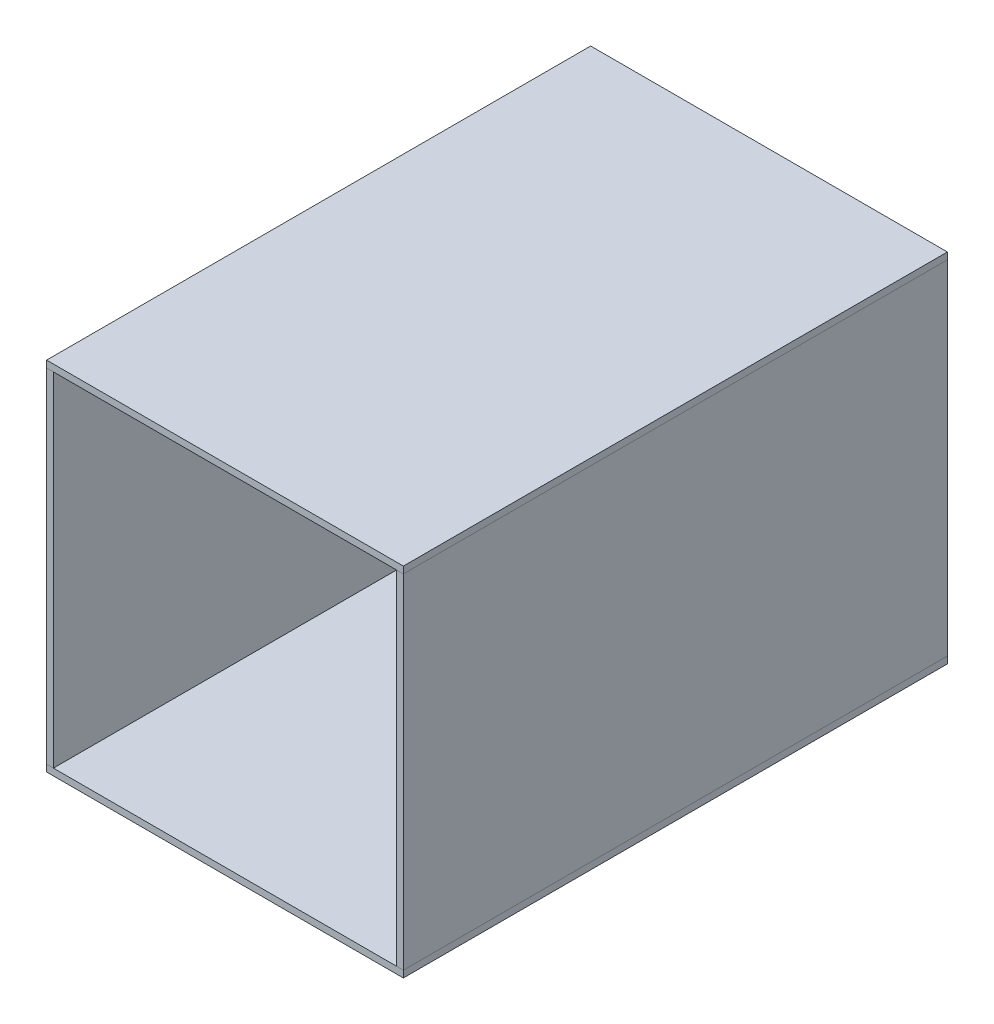
ISO-10303-21;
HEADER;
FILE_DESCRIPTION(('STEP AP214'),'2;1');
FILE_NAME('part.step','',(''),(''),'','','');
FILE_SCHEMA(('AUTOMOTIVE_DESIGN { 1 0 10303 214 1 1 1 1 }'));
ENDSEC;
DATA;
#1=APPLICATION_CONTEXT('core data for automotive mechanical design processes');
#2=APPLICATION_PROTOCOL_DEFINITION('international standard','automotive_design',2000,#1);
#3=PRODUCT_CONTEXT('',#1,'mechanical');
#4=PRODUCT('Part','Part','',(#3));
#5=PRODUCT_RELATED_PRODUCT_CATEGORY('part','',(#4));
#6=PRODUCT_DEFINITION_FORMATION('','',#4);
#7=PRODUCT_DEFINITION_CONTEXT('part definition',#1,'design');
#8=PRODUCT_DEFINITION('design','',#6,#7);
#9=PRODUCT_DEFINITION_SHAPE('','',#8);
#10=(LENGTH_UNIT() NAMED_UNIT(*) SI_UNIT(.MILLI.,.METRE.));
#11=(NAMED_UNIT(*) PLANE_ANGLE_UNIT() SI_UNIT($,.RADIAN.));
#12=(NAMED_UNIT(*) SI_UNIT($,.STERADIAN.) SOLID_ANGLE_UNIT());
#13=UNCERTAINTY_MEASURE_WITH_UNIT(LENGTH_MEASURE(1.E-05),#10,'distance_accuracy_value','');
#14=(GEOMETRIC_REPRESENTATION_CONTEXT(3) GLOBAL_UNCERTAINTY_ASSIGNED_CONTEXT((#13)) GLOBAL_UNIT_ASSIGNED_CONTEXT((#10,
#11,#12)) REPRESENTATION_CONTEXT('',''));
#15=CARTESIAN_POINT('',(0.,0.,0.));
#16=DIRECTION('',(0.,0.,1.));
#17=DIRECTION('',(1.,0.,0.));
#18=AXIS2_PLACEMENT_3D('',#15,#16,#17);
#19=CARTESIAN_POINT('',(0.,9.525,1262.59071739535));
#20=DIRECTION('',(0.,1.,0.));
#21=DIRECTION('',(0.,0.,1.));
#22=AXIS2_PLACEMENT_3D('',#19,#20,#21);
#23=PLANE('',#22);
#24=DIRECTION('',(0.,0.,-1.));
#25=VECTOR('',#24,1.);
#26=CARTESIAN_POINT('',(-250.,9.525,1262.59071739535));
#27=LINE('',#26,#25);
#28=CARTESIAN_POINT('',(-250.,9.525,762.5));
#29=VERTEX_POINT('',#28);
#30=CARTESIAN_POINT('',(-250.,9.525,0.));
#31=VERTEX_POINT('',#30);
#32=EDGE_CURVE('E90',#29,#31,#27,.T.);
#33=ORIENTED_EDGE('',*,*,#32,.F.);
#34=DIRECTION('',(1.,0.,0.));
#35=VECTOR('',#34,1.);
#36=CARTESIAN_POINT('',(0.,9.525,762.5));
#37=LINE('',#36,#35);
#38=CARTESIAN_POINT('',(250.,9.525,762.5));
#39=VERTEX_POINT('',#38);
#40=EDGE_CURVE('E102',#29,#39,#37,.T.);
#41=ORIENTED_EDGE('',*,*,#40,.T.);
#42=DIRECTION('',(0.,0.,-1.));
#43=VECTOR('',#42,1.);
#44=CARTESIAN_POINT('',(250.,9.525,1262.59071739535));
#45=LINE('',#44,#43);
#46=CARTESIAN_POINT('',(250.,9.525,0.));
#47=VERTEX_POINT('',#46);
#48=EDGE_CURVE('E55',#39,#47,#45,.T.);
#49=ORIENTED_EDGE('',*,*,#48,.T.);
#50=DIRECTION('',(1.,0.,0.));
#51=VECTOR('',#50,1.);
#52=CARTESIAN_POINT('',(0.,9.525,0.));
#53=LINE('',#52,#51);
#54=EDGE_CURVE('E99',#31,#47,#53,.T.);
#55=ORIENTED_EDGE('',*,*,#54,.F.);
#56=EDGE_LOOP('',(#33,#41,#49,#55));
#57=FACE_BOUND('',#56,.T.);
#58=ADVANCED_FACE('F51',(#57),#23,.T.);
#59=CARTESIAN_POINT('',(-250.,0.,1262.59071739535));
#60=DIRECTION('',(-1.,0.,0.));
#61=DIRECTION('',(0.,0.,1.));
#62=AXIS2_PLACEMENT_3D('',#59,#60,#61);
#63=PLANE('',#62);
#64=DIRECTION('',(0.,0.,-1.));
#65=VECTOR('',#64,1.);
#66=CARTESIAN_POINT('',(-250.,0.,1262.59071739535));
#67=LINE('',#66,#65);
#68=CARTESIAN_POINT('',(-250.,0.,762.5));
#69=VERTEX_POINT('',#68);
#70=CARTESIAN_POINT('',(-250.,0.,0.));
#71=VERTEX_POINT('',#70);
#72=EDGE_CURVE('E120',#69,#71,#67,.T.);
#73=ORIENTED_EDGE('',*,*,#72,.F.);
#74=DIRECTION('',(0.,1.,0.));
#75=VECTOR('',#74,1.);
#76=CARTESIAN_POINT('',(-250.,0.,762.5));
#77=LINE('',#76,#75);
#78=EDGE_CURVE('E96',#69,#29,#77,.T.);
#79=ORIENTED_EDGE('',*,*,#78,.T.);
#80=ORIENTED_EDGE('',*,*,#32,.T.);
#81=DIRECTION('',(0.,1.,0.));
#82=VECTOR('',#81,1.);
#83=CARTESIAN_POINT('',(-250.,0.,0.));
#84=LINE('',#83,#82);
#85=EDGE_CURVE('E110',#71,#31,#84,.T.);
#86=ORIENTED_EDGE('',*,*,#85,.F.);
#87=EDGE_LOOP('',(#73,#79,#80,#86));
#88=FACE_BOUND('',#87,.T.);
#89=ADVANCED_FACE('F124',(#88),#63,.T.);
#90=CARTESIAN_POINT('',(0.,0.,1262.59071739535));
#91=DIRECTION('',(0.,1.,0.));
#92=DIRECTION('',(0.,0.,1.));
#93=AXIS2_PLACEMENT_3D('',#90,#91,#92);
#94=PLANE('',#93);
#95=DIRECTION('',(1.,0.,0.));
#96=VECTOR('',#95,1.);
#97=CARTESIAN_POINT('',(0.,0.,762.5));
#98=LINE('',#97,#96);
#99=CARTESIAN_POINT('',(250.,0.,762.5));
#100=VERTEX_POINT('',#99);
#101=EDGE_CURVE('E60',#69,#100,#98,.T.);
#102=ORIENTED_EDGE('',*,*,#101,.F.);
#103=ORIENTED_EDGE('',*,*,#72,.T.);
#104=DIRECTION('',(1.,0.,0.));
#105=VECTOR('',#104,1.);
#106=CARTESIAN_POINT('',(0.,0.,0.));
#107=LINE('',#106,#105);
#108=CARTESIAN_POINT('',(250.,0.,0.));
#109=VERTEX_POINT('',#108);
#110=EDGE_CURVE('E121',#71,#109,#107,.T.);
#111=ORIENTED_EDGE('',*,*,#110,.T.);
#112=DIRECTION('',(0.,0.,-1.));
#113=VECTOR('',#112,1.);
#114=CARTESIAN_POINT('',(250.,0.,1262.59071739535));
#115=LINE('',#114,#113);
#116=EDGE_CURVE('E73',#100,#109,#115,.T.);
#117=ORIENTED_EDGE('',*,*,#116,.F.);
#118=EDGE_LOOP('',(#102,#103,#111,#117));
#119=FACE_BOUND('',#118,.T.);
#120=ADVANCED_FACE('F123',(#119),#94,.F.);
#121=CARTESIAN_POINT('',(250.,0.,1262.59071739535));
#122=DIRECTION('',(-1.,0.,0.));
#123=DIRECTION('',(0.,0.,1.));
#124=AXIS2_PLACEMENT_3D('',#121,#122,#123);
#125=PLANE('',#124);
#126=DIRECTION('',(0.,1.,0.));
#127=VECTOR('',#126,1.);
#128=CARTESIAN_POINT('',(250.,0.,762.5));
#129=LINE('',#128,#127);
#130=EDGE_CURVE('E12',#100,#39,#129,.T.);
#131=ORIENTED_EDGE('',*,*,#130,.F.);
#132=ORIENTED_EDGE('',*,*,#116,.T.);
#133=DIRECTION('',(0.,1.,0.));
#134=VECTOR('',#133,1.);
#135=CARTESIAN_POINT('',(250.,0.,0.));
#136=LINE('',#135,#134);
#137=EDGE_CURVE('E104',#109,#47,#136,.T.);
#138=ORIENTED_EDGE('',*,*,#137,.T.);
#139=ORIENTED_EDGE('',*,*,#48,.F.);
#140=EDGE_LOOP('',(#131,#132,#138,#139));
#141=FACE_BOUND('',#140,.T.);
#142=ADVANCED_FACE('F105',(#141),#125,.F.);
#143=CARTESIAN_POINT('',(0.,0.,0.));
#144=DIRECTION('',(0.,0.,1.));
#145=DIRECTION('',(1.,0.,0.));
#146=AXIS2_PLACEMENT_3D('',#143,#144,#145);
#147=PLANE('',#146);
#148=ORIENTED_EDGE('',*,*,#54,.T.);
#149=ORIENTED_EDGE('',*,*,#137,.F.);
#150=ORIENTED_EDGE('',*,*,#110,.F.);
#151=ORIENTED_EDGE('',*,*,#85,.T.);
#152=EDGE_LOOP('',(#148,#149,#150,#151));
#153=FACE_BOUND('',#152,.T.);
#154=ADVANCED_FACE('F109',(#153),#147,.F.);
#155=CARTESIAN_POINT('',(0.,0.,762.5));
#156=DIRECTION('',(0.,0.,1.));
#157=DIRECTION('',(1.,0.,0.));
#158=AXIS2_PLACEMENT_3D('',#155,#156,#157);
#159=PLANE('',#158);
#160=ORIENTED_EDGE('',*,*,#40,.F.);
#161=ORIENTED_EDGE('',*,*,#78,.F.);
#162=ORIENTED_EDGE('',*,*,#101,.T.);
#163=ORIENTED_EDGE('',*,*,#130,.T.);
#164=EDGE_LOOP('',(#160,#161,#162,#163));
#165=FACE_BOUND('',#164,.T.);
#166=ADVANCED_FACE('F53',(#165),#159,.T.);
#167=CLOSED_SHELL('',(#58,#89,#120,#142,#154,#166));
#168=MANIFOLD_SOLID_BREP('B2',#167);
#169=CARTESIAN_POINT('',(0.,0.,762.5));
#170=DIRECTION('',(0.,0.,1.));
#171=DIRECTION('',(1.,0.,0.));
#172=AXIS2_PLACEMENT_3D('',#169,#170,#171);
#173=PLANE('',#172);
#174=DIRECTION('',(0.,1.,0.));
#175=VECTOR('',#174,1.);
#176=CARTESIAN_POINT('',(-250.,0.,762.5));
#177=LINE('',#176,#175);
#178=CARTESIAN_POINT('',(-250.,490.475,762.5));
#179=VERTEX_POINT('',#178);
#180=CARTESIAN_POINT('',(-250.,500.,762.5));
#181=VERTEX_POINT('',#180);
#182=EDGE_CURVE('E195',#179,#181,#177,.T.);
#183=ORIENTED_EDGE('',*,*,#182,.F.);
#184=DIRECTION('',(1.,0.,0.));
#185=VECTOR('',#184,1.);
#186=CARTESIAN_POINT('',(0.,490.475,762.5));
#187=LINE('',#186,#185);
#188=CARTESIAN_POINT('',(250.,490.475,762.5));
#189=VERTEX_POINT('',#188);
#190=EDGE_CURVE('E221',#179,#189,#187,.T.);
#191=ORIENTED_EDGE('',*,*,#190,.T.);
#192=DIRECTION('',(0.,1.,0.));
#193=VECTOR('',#192,1.);
#194=CARTESIAN_POINT('',(250.,0.,762.5));
#195=LINE('',#194,#193);
#196=CARTESIAN_POINT('',(250.,500.,762.5));
#197=VERTEX_POINT('',#196);
#198=EDGE_CURVE('E225',#189,#197,#195,.T.);
#199=ORIENTED_EDGE('',*,*,#198,.T.);
#200=DIRECTION('',(1.,0.,0.));
#201=VECTOR('',#200,1.);
#202=CARTESIAN_POINT('',(0.,500.,762.5));
#203=LINE('',#202,#201);
#204=EDGE_CURVE('E228',#181,#197,#203,.T.);
#205=ORIENTED_EDGE('',*,*,#204,.F.);
#206=EDGE_LOOP('',(#183,#191,#199,#205));
#207=FACE_BOUND('',#206,.T.);
#208=ADVANCED_FACE('F187',(#207),#173,.T.);
#209=CARTESIAN_POINT('',(0.,0.,0.));
#210=DIRECTION('',(0.,0.,1.));
#211=DIRECTION('',(1.,0.,0.));
#212=AXIS2_PLACEMENT_3D('',#209,#210,#211);
#213=PLANE('',#212);
#214=DIRECTION('',(0.,1.,0.));
#215=VECTOR('',#214,1.);
#216=CARTESIAN_POINT('',(-250.,0.,0.));
#217=LINE('',#216,#215);
#218=CARTESIAN_POINT('',(-250.,490.475,0.));
#219=VERTEX_POINT('',#218);
#220=CARTESIAN_POINT('',(-250.,500.,0.));
#221=VERTEX_POINT('',#220);
#222=EDGE_CURVE('E244',#219,#221,#217,.T.);
#223=ORIENTED_EDGE('',*,*,#222,.T.);
#224=DIRECTION('',(1.,0.,0.));
#225=VECTOR('',#224,1.);
#226=CARTESIAN_POINT('',(0.,500.,0.));
#227=LINE('',#226,#225);
#228=CARTESIAN_POINT('',(250.,500.,0.));
#229=VERTEX_POINT('',#228);
#230=EDGE_CURVE('E232',#221,#229,#227,.T.);
#231=ORIENTED_EDGE('',*,*,#230,.T.);
#232=DIRECTION('',(0.,1.,0.));
#233=VECTOR('',#232,1.);
#234=CARTESIAN_POINT('',(250.,0.,0.));
#235=LINE('',#234,#233);
#236=CARTESIAN_POINT('',(250.,490.475,0.));
#237=VERTEX_POINT('',#236);
#238=EDGE_CURVE('E248',#237,#229,#235,.T.);
#239=ORIENTED_EDGE('',*,*,#238,.F.);
#240=DIRECTION('',(1.,0.,0.));
#241=VECTOR('',#240,1.);
#242=CARTESIAN_POINT('',(0.,490.475,0.));
#243=LINE('',#242,#241);
#244=EDGE_CURVE('E236',#219,#237,#243,.T.);
#245=ORIENTED_EDGE('',*,*,#244,.F.);
#246=EDGE_LOOP('',(#223,#231,#239,#245));
#247=FACE_BOUND('',#246,.T.);
#248=ADVANCED_FACE('F261',(#247),#213,.F.);
#249=CARTESIAN_POINT('',(0.,500.,1262.59071739535));
#250=DIRECTION('',(0.,1.,0.));
#251=DIRECTION('',(0.,0.,1.));
#252=AXIS2_PLACEMENT_3D('',#249,#250,#251);
#253=PLANE('',#252);
#254=DIRECTION('',(0.,0.,-1.));
#255=VECTOR('',#254,1.);
#256=CARTESIAN_POINT('',(-250.,500.,1262.59071739535));
#257=LINE('',#256,#255);
#258=EDGE_CURVE('E49',#181,#221,#257,.T.);
#259=ORIENTED_EDGE('',*,*,#258,.F.);
#260=ORIENTED_EDGE('',*,*,#204,.T.);
#261=DIRECTION('',(0.,0.,-1.));
#262=VECTOR('',#261,1.);
#263=CARTESIAN_POINT('',(250.,500.,1262.59071739535));
#264=LINE('',#263,#262);
#265=EDGE_CURVE('E231',#197,#229,#264,.T.);
#266=ORIENTED_EDGE('',*,*,#265,.T.);
#267=ORIENTED_EDGE('',*,*,#230,.F.);
#268=EDGE_LOOP('',(#259,#260,#266,#267));
#269=FACE_BOUND('',#268,.T.);
#270=ADVANCED_FACE('F239',(#269),#253,.T.);
#271=CARTESIAN_POINT('',(250.,0.,1262.59071739535));
#272=DIRECTION('',(-1.,0.,0.));
#273=DIRECTION('',(0.,0.,1.));
#274=AXIS2_PLACEMENT_3D('',#271,#272,#273);
#275=PLANE('',#274);
#276=ORIENTED_EDGE('',*,*,#198,.F.);
#277=DIRECTION('',(0.,0.,-1.));
#278=VECTOR('',#277,1.);
#279=CARTESIAN_POINT('',(250.,490.475,1262.59071739535));
#280=LINE('',#279,#278);
#281=EDGE_CURVE('E250',#189,#237,#280,.T.);
#282=ORIENTED_EDGE('',*,*,#281,.T.);
#283=ORIENTED_EDGE('',*,*,#238,.T.);
#284=ORIENTED_EDGE('',*,*,#265,.F.);
#285=EDGE_LOOP('',(#276,#282,#283,#284));
#286=FACE_BOUND('',#285,.T.);
#287=ADVANCED_FACE('F257',(#286),#275,.F.);
#288=CARTESIAN_POINT('',(0.,490.475,1262.59071739535));
#289=DIRECTION('',(0.,1.,0.));
#290=DIRECTION('',(0.,0.,1.));
#291=AXIS2_PLACEMENT_3D('',#288,#289,#290);
#292=PLANE('',#291);
#293=ORIENTED_EDGE('',*,*,#190,.F.);
#294=DIRECTION('',(0.,0.,-1.));
#295=VECTOR('',#294,1.);
#296=CARTESIAN_POINT('',(-250.,490.475,1262.59071739535));
#297=LINE('',#296,#295);
#298=EDGE_CURVE('E235',#179,#219,#297,.T.);
#299=ORIENTED_EDGE('',*,*,#298,.T.);
#300=ORIENTED_EDGE('',*,*,#244,.T.);
#301=ORIENTED_EDGE('',*,*,#281,.F.);
#302=EDGE_LOOP('',(#293,#299,#300,#301));
#303=FACE_BOUND('',#302,.T.);
#304=ADVANCED_FACE('F260',(#303),#292,.F.);
#305=CARTESIAN_POINT('',(-250.,0.,1262.59071739535));
#306=DIRECTION('',(-1.,0.,0.));
#307=DIRECTION('',(0.,0.,1.));
#308=AXIS2_PLACEMENT_3D('',#305,#306,#307);
#309=PLANE('',#308);
#310=ORIENTED_EDGE('',*,*,#298,.F.);
#311=ORIENTED_EDGE('',*,*,#182,.T.);
#312=ORIENTED_EDGE('',*,*,#258,.T.);
#313=ORIENTED_EDGE('',*,*,#222,.F.);
#314=EDGE_LOOP('',(#310,#311,#312,#313));
#315=FACE_BOUND('',#314,.T.);
#316=ADVANCED_FACE('F234',(#315),#309,.T.);
#317=CLOSED_SHELL('',(#208,#248,#270,#287,#304,#316));
#318=MANIFOLD_SOLID_BREP('B6',#317);
#319=CARTESIAN_POINT('',(240.475,0.,762.5));
#320=DIRECTION('',(-1.,0.,0.));
#321=DIRECTION('',(0.,0.,1.));
#322=AXIS2_PLACEMENT_3D('',#319,#320,#321);
#323=PLANE('',#322);
#324=DIRECTION('',(0.,1.,0.));
#325=VECTOR('',#324,1.);
#326=CARTESIAN_POINT('',(240.475,0.,0.));
#327=LINE('',#326,#325);
#328=CARTESIAN_POINT('',(240.475,9.525,0.));
#329=VERTEX_POINT('',#328);
#330=CARTESIAN_POINT('',(240.475,490.475,0.));
#331=VERTEX_POINT('',#330);
#332=EDGE_CURVE('E385',#329,#331,#327,.T.);
#333=ORIENTED_EDGE('',*,*,#332,.F.);
#334=DIRECTION('',(0.,0.,-1.));
#335=VECTOR('',#334,1.);
#336=CARTESIAN_POINT('',(240.475,9.525,762.5));
#337=LINE('',#336,#335);
#338=CARTESIAN_POINT('',(240.475,9.525,762.5));
#339=VERTEX_POINT('',#338);
#340=EDGE_CURVE('E185',#339,#329,#337,.T.);
#341=ORIENTED_EDGE('',*,*,#340,.F.);
#342=DIRECTION('',(0.,1.,0.));
#343=VECTOR('',#342,1.);
#344=CARTESIAN_POINT('',(240.475,0.,762.5));
#345=LINE('',#344,#343);
#346=CARTESIAN_POINT('',(240.475,490.475,762.5));
#347=VERTEX_POINT('',#346);
#348=EDGE_CURVE('E370',#339,#347,#345,.T.);
#349=ORIENTED_EDGE('',*,*,#348,.T.);
#350=DIRECTION('',(0.,0.,-1.));
#351=VECTOR('',#350,1.);
#352=CARTESIAN_POINT('',(240.475,490.475,762.5));
#353=LINE('',#352,#351);
#354=EDGE_CURVE('E338',#347,#331,#353,.T.);
#355=ORIENTED_EDGE('',*,*,#354,.T.);
#356=EDGE_LOOP('',(#333,#341,#349,#355));
#357=FACE_BOUND('',#356,.T.);
#358=ADVANCED_FACE('F322',(#357),#323,.T.);
#359=CARTESIAN_POINT('',(0.,9.525,762.5));
#360=DIRECTION('',(0.,1.,0.));
#361=DIRECTION('',(0.,0.,1.));
#362=AXIS2_PLACEMENT_3D('',#359,#360,#361);
#363=PLANE('',#362);
#364=DIRECTION('',(1.,0.,0.));
#365=VECTOR('',#364,1.);
#366=CARTESIAN_POINT('',(0.,9.525,0.));
#367=LINE('',#366,#365);
#368=CARTESIAN_POINT('',(250.,9.525,0.));
#369=VERTEX_POINT('',#368);
#370=EDGE_CURVE('E376',#329,#369,#367,.T.);
#371=ORIENTED_EDGE('',*,*,#370,.T.);
#372=DIRECTION('',(0.,0.,-1.));
#373=VECTOR('',#372,1.);
#374=CARTESIAN_POINT('',(250.,9.525,762.5));
#375=LINE('',#374,#373);
#376=CARTESIAN_POINT('',(250.,9.525,762.5));
#377=VERTEX_POINT('',#376);
#378=EDGE_CURVE('E330',#377,#369,#375,.T.);
#379=ORIENTED_EDGE('',*,*,#378,.F.);
#380=DIRECTION('',(1.,0.,0.));
#381=VECTOR('',#380,1.);
#382=CARTESIAN_POINT('',(0.,9.525,762.5));
#383=LINE('',#382,#381);
#384=EDGE_CURVE('E364',#339,#377,#383,.T.);
#385=ORIENTED_EDGE('',*,*,#384,.F.);
#386=ORIENTED_EDGE('',*,*,#340,.T.);
#387=EDGE_LOOP('',(#371,#379,#385,#386));
#388=FACE_BOUND('',#387,.T.);
#389=ADVANCED_FACE('F374',(#388),#363,.F.);
#390=CARTESIAN_POINT('',(250.,0.,762.5));
#391=DIRECTION('',(-1.,0.,0.));
#392=DIRECTION('',(0.,0.,1.));
#393=AXIS2_PLACEMENT_3D('',#390,#391,#392);
#394=PLANE('',#393);
#395=DIRECTION('',(0.,1.,0.));
#396=VECTOR('',#395,1.);
#397=CARTESIAN_POINT('',(250.,0.,0.));
#398=LINE('',#397,#396);
#399=CARTESIAN_POINT('',(250.,490.475,0.));
#400=VERTEX_POINT('',#399);
#401=EDGE_CURVE('E388',#369,#400,#398,.T.);
#402=ORIENTED_EDGE('',*,*,#401,.T.);
#403=DIRECTION('',(0.,0.,-1.));
#404=VECTOR('',#403,1.);
#405=CARTESIAN_POINT('',(250.,490.475,762.5));
#406=LINE('',#405,#404);
#407=CARTESIAN_POINT('',(250.,490.475,762.5));
#408=VERTEX_POINT('',#407);
#409=EDGE_CURVE('E352',#408,#400,#406,.T.);
#410=ORIENTED_EDGE('',*,*,#409,.F.);
#411=DIRECTION('',(0.,1.,0.));
#412=VECTOR('',#411,1.);
#413=CARTESIAN_POINT('',(250.,0.,762.5));
#414=LINE('',#413,#412);
#415=EDGE_CURVE('E369',#377,#408,#414,.T.);
#416=ORIENTED_EDGE('',*,*,#415,.F.);
#417=ORIENTED_EDGE('',*,*,#378,.T.);
#418=EDGE_LOOP('',(#402,#410,#416,#417));
#419=FACE_BOUND('',#418,.T.);
#420=ADVANCED_FACE('F379',(#419),#394,.F.);
#421=CARTESIAN_POINT('',(0.,490.475,762.5));
#422=DIRECTION('',(0.,1.,0.));
#423=DIRECTION('',(0.,0.,1.));
#424=AXIS2_PLACEMENT_3D('',#421,#422,#423);
#425=PLANE('',#424);
#426=DIRECTION('',(1.,0.,0.));
#427=VECTOR('',#426,1.);
#428=CARTESIAN_POINT('',(0.,490.475,0.));
#429=LINE('',#428,#427);
#430=EDGE_CURVE('E390',#331,#400,#429,.T.);
#431=ORIENTED_EDGE('',*,*,#430,.F.);
#432=ORIENTED_EDGE('',*,*,#354,.F.);
#433=DIRECTION('',(1.,0.,0.));
#434=VECTOR('',#433,1.);
#435=CARTESIAN_POINT('',(0.,490.475,762.5));
#436=LINE('',#435,#434);
#437=EDGE_CURVE('E380',#347,#408,#436,.T.);
#438=ORIENTED_EDGE('',*,*,#437,.T.);
#439=ORIENTED_EDGE('',*,*,#409,.T.);
#440=EDGE_LOOP('',(#431,#432,#438,#439));
#441=FACE_BOUND('',#440,.T.);
#442=ADVANCED_FACE('F395',(#441),#425,.T.);
#443=CARTESIAN_POINT('',(0.,0.,762.5));
#444=DIRECTION('',(0.,0.,1.));
#445=DIRECTION('',(1.,0.,0.));
#446=AXIS2_PLACEMENT_3D('',#443,#444,#445);
#447=PLANE('',#446);
#448=ORIENTED_EDGE('',*,*,#348,.F.);
#449=ORIENTED_EDGE('',*,*,#384,.T.);
#450=ORIENTED_EDGE('',*,*,#415,.T.);
#451=ORIENTED_EDGE('',*,*,#437,.F.);
#452=EDGE_LOOP('',(#448,#449,#450,#451));
#453=FACE_BOUND('',#452,.T.);
#454=ADVANCED_FACE('F366',(#453),#447,.T.);
#455=CARTESIAN_POINT('',(0.,0.,0.));
#456=DIRECTION('',(0.,0.,1.));
#457=DIRECTION('',(1.,0.,0.));
#458=AXIS2_PLACEMENT_3D('',#455,#456,#457);
#459=PLANE('',#458);
#460=ORIENTED_EDGE('',*,*,#332,.T.);
#461=ORIENTED_EDGE('',*,*,#430,.T.);
#462=ORIENTED_EDGE('',*,*,#401,.F.);
#463=ORIENTED_EDGE('',*,*,#370,.F.);
#464=EDGE_LOOP('',(#460,#461,#462,#463));
#465=FACE_BOUND('',#464,.T.);
#466=ADVANCED_FACE('F402',(#465),#459,.F.);
#467=CLOSED_SHELL('',(#358,#389,#420,#442,#454,#466));
#468=MANIFOLD_SOLID_BREP('B43',#467);
#469=CARTESIAN_POINT('',(-250.,0.,762.5));
#470=DIRECTION('',(-1.,0.,0.));
#471=DIRECTION('',(0.,0.,1.));
#472=AXIS2_PLACEMENT_3D('',#469,#470,#471);
#473=PLANE('',#472);
#474=DIRECTION('',(0.,1.,0.));
#475=VECTOR('',#474,1.);
#476=CARTESIAN_POINT('',(-250.,0.,0.));
#477=LINE('',#476,#475);
#478=CARTESIAN_POINT('',(-250.,9.525,0.));
#479=VERTEX_POINT('',#478);
#480=CARTESIAN_POINT('',(-250.,490.475,0.));
#481=VERTEX_POINT('',#480);
#482=EDGE_CURVE('E508',#479,#481,#477,.T.);
#483=ORIENTED_EDGE('',*,*,#482,.F.);
#484=DIRECTION('',(0.,0.,-1.));
#485=VECTOR('',#484,1.);
#486=CARTESIAN_POINT('',(-250.,9.525,762.5));
#487=LINE('',#486,#485);
#488=CARTESIAN_POINT('',(-250.,9.525,762.5));
#489=VERTEX_POINT('',#488);
#490=EDGE_CURVE('E320',#489,#479,#487,.T.);
#491=ORIENTED_EDGE('',*,*,#490,.F.);
#492=DIRECTION('',(0.,1.,0.));
#493=VECTOR('',#492,1.);
#494=CARTESIAN_POINT('',(-250.,0.,762.5));
#495=LINE('',#494,#493);
#496=CARTESIAN_POINT('',(-250.,490.475,762.5));
#497=VERTEX_POINT('',#496);
#498=EDGE_CURVE('E493',#489,#497,#495,.T.);
#499=ORIENTED_EDGE('',*,*,#498,.T.);
#500=DIRECTION('',(0.,0.,-1.));
#501=VECTOR('',#500,1.);
#502=CARTESIAN_POINT('',(-250.,490.475,762.5));
#503=LINE('',#502,#501);
#504=EDGE_CURVE('E461',#497,#481,#503,.T.);
#505=ORIENTED_EDGE('',*,*,#504,.T.);
#506=EDGE_LOOP('',(#483,#491,#499,#505));
#507=FACE_BOUND('',#506,.T.);
#508=ADVANCED_FACE('F445',(#507),#473,.T.);
#509=CARTESIAN_POINT('',(0.,9.525,762.5));
#510=DIRECTION('',(0.,1.,0.));
#511=DIRECTION('',(0.,0.,1.));
#512=AXIS2_PLACEMENT_3D('',#509,#510,#511);
#513=PLANE('',#512);
#514=DIRECTION('',(1.,0.,0.));
#515=VECTOR('',#514,1.);
#516=CARTESIAN_POINT('',(0.,9.525,0.));
#517=LINE('',#516,#515);
#518=CARTESIAN_POINT('',(-240.475,9.525,0.));
#519=VERTEX_POINT('',#518);
#520=EDGE_CURVE('E499',#479,#519,#517,.T.);
#521=ORIENTED_EDGE('',*,*,#520,.T.);
#522=DIRECTION('',(0.,0.,-1.));
#523=VECTOR('',#522,1.);
#524=CARTESIAN_POINT('',(-240.475,9.525,762.5));
#525=LINE('',#524,#523);
#526=CARTESIAN_POINT('',(-240.475,9.525,762.5));
#527=VERTEX_POINT('',#526);
#528=EDGE_CURVE('E453',#527,#519,#525,.T.);
#529=ORIENTED_EDGE('',*,*,#528,.F.);
#530=DIRECTION('',(1.,0.,0.));
#531=VECTOR('',#530,1.);
#532=CARTESIAN_POINT('',(0.,9.525,762.5));
#533=LINE('',#532,#531);
#534=EDGE_CURVE('E487',#489,#527,#533,.T.);
#535=ORIENTED_EDGE('',*,*,#534,.F.);
#536=ORIENTED_EDGE('',*,*,#490,.T.);
#537=EDGE_LOOP('',(#521,#529,#535,#536));
#538=FACE_BOUND('',#537,.T.);
#539=ADVANCED_FACE('F497',(#538),#513,.F.);
#540=CARTESIAN_POINT('',(-240.475,0.,762.5));
#541=DIRECTION('',(-1.,0.,0.));
#542=DIRECTION('',(0.,0.,1.));
#543=AXIS2_PLACEMENT_3D('',#540,#541,#542);
#544=PLANE('',#543);
#545=DIRECTION('',(0.,1.,0.));
#546=VECTOR('',#545,1.);
#547=CARTESIAN_POINT('',(-240.475,0.,0.));
#548=LINE('',#547,#546);
#549=CARTESIAN_POINT('',(-240.475,490.475,0.));
#550=VERTEX_POINT('',#549);
#551=EDGE_CURVE('E511',#519,#550,#548,.T.);
#552=ORIENTED_EDGE('',*,*,#551,.T.);
#553=DIRECTION('',(0.,0.,-1.));
#554=VECTOR('',#553,1.);
#555=CARTESIAN_POINT('',(-240.475,490.475,762.5));
#556=LINE('',#555,#554);
#557=CARTESIAN_POINT('',(-240.475,490.475,762.5));
#558=VERTEX_POINT('',#557);
#559=EDGE_CURVE('E475',#558,#550,#556,.T.);
#560=ORIENTED_EDGE('',*,*,#559,.F.);
#561=DIRECTION('',(0.,1.,0.));
#562=VECTOR('',#561,1.);
#563=CARTESIAN_POINT('',(-240.475,0.,762.5));
#564=LINE('',#563,#562);
#565=EDGE_CURVE('E492',#527,#558,#564,.T.);
#566=ORIENTED_EDGE('',*,*,#565,.F.);
#567=ORIENTED_EDGE('',*,*,#528,.T.);
#568=EDGE_LOOP('',(#552,#560,#566,#567));
#569=FACE_BOUND('',#568,.T.);
#570=ADVANCED_FACE('F502',(#569),#544,.F.);
#571=CARTESIAN_POINT('',(0.,490.475,762.5));
#572=DIRECTION('',(0.,1.,0.));
#573=DIRECTION('',(0.,0.,1.));
#574=AXIS2_PLACEMENT_3D('',#571,#572,#573);
#575=PLANE('',#574);
#576=DIRECTION('',(1.,0.,0.));
#577=VECTOR('',#576,1.);
#578=CARTESIAN_POINT('',(0.,490.475,0.));
#579=LINE('',#578,#577);
#580=EDGE_CURVE('E513',#481,#550,#579,.T.);
#581=ORIENTED_EDGE('',*,*,#580,.F.);
#582=ORIENTED_EDGE('',*,*,#504,.F.);
#583=DIRECTION('',(1.,0.,0.));
#584=VECTOR('',#583,1.);
#585=CARTESIAN_POINT('',(0.,490.475,762.5));
#586=LINE('',#585,#584);
#587=EDGE_CURVE('E503',#497,#558,#586,.T.);
#588=ORIENTED_EDGE('',*,*,#587,.T.);
#589=ORIENTED_EDGE('',*,*,#559,.T.);
#590=EDGE_LOOP('',(#581,#582,#588,#589));
#591=FACE_BOUND('',#590,.T.);
#592=ADVANCED_FACE('F518',(#591),#575,.T.);
#593=CARTESIAN_POINT('',(0.,0.,762.5));
#594=DIRECTION('',(0.,0.,1.));
#595=DIRECTION('',(1.,0.,0.));
#596=AXIS2_PLACEMENT_3D('',#593,#594,#595);
#597=PLANE('',#596);
#598=ORIENTED_EDGE('',*,*,#498,.F.);
#599=ORIENTED_EDGE('',*,*,#534,.T.);
#600=ORIENTED_EDGE('',*,*,#565,.T.);
#601=ORIENTED_EDGE('',*,*,#587,.F.);
#602=EDGE_LOOP('',(#598,#599,#600,#601));
#603=FACE_BOUND('',#602,.T.);
#604=ADVANCED_FACE('F489',(#603),#597,.T.);
#605=CARTESIAN_POINT('',(0.,0.,0.));
#606=DIRECTION('',(0.,0.,1.));
#607=DIRECTION('',(1.,0.,0.));
#608=AXIS2_PLACEMENT_3D('',#605,#606,#607);
#609=PLANE('',#608);
#610=ORIENTED_EDGE('',*,*,#482,.T.);
#611=ORIENTED_EDGE('',*,*,#580,.T.);
#612=ORIENTED_EDGE('',*,*,#551,.F.);
#613=ORIENTED_EDGE('',*,*,#520,.F.);
#614=EDGE_LOOP('',(#610,#611,#612,#613));
#615=FACE_BOUND('',#614,.T.);
#616=ADVANCED_FACE('F525',(#615),#609,.F.);
#617=CLOSED_SHELL('',(#508,#539,#570,#592,#604,#616));
#618=MANIFOLD_SOLID_BREP('B179',#617);
#619=ADVANCED_BREP_SHAPE_REPRESENTATION('',(#18,#168,#318,#468,#618),#14);
#620=SHAPE_DEFINITION_REPRESENTATION(#9,#619);
ENDSEC;
END-ISO-10303-21;
